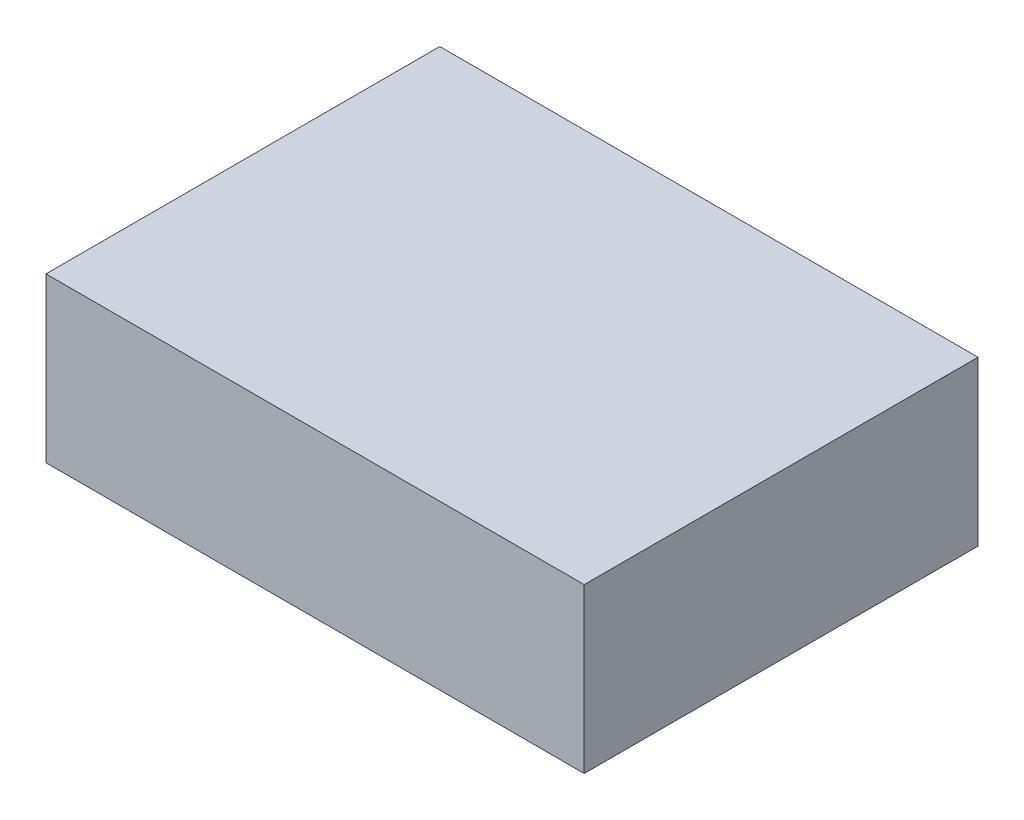
ISO-10303-21;
HEADER;
FILE_DESCRIPTION(('STEP AP214'),'2;1');
FILE_NAME('part.step','',(''),(''),'','','');
FILE_SCHEMA(('AUTOMOTIVE_DESIGN { 1 0 10303 214 1 1 1 1 }'));
ENDSEC;
DATA;
#1=APPLICATION_CONTEXT('core data for automotive mechanical design processes');
#2=APPLICATION_PROTOCOL_DEFINITION('international standard','automotive_design',2000,#1);
#3=PRODUCT_CONTEXT('',#1,'mechanical');
#4=PRODUCT('Part','Part','',(#3));
#5=PRODUCT_RELATED_PRODUCT_CATEGORY('part','',(#4));
#6=PRODUCT_DEFINITION_FORMATION('','',#4);
#7=PRODUCT_DEFINITION_CONTEXT('part definition',#1,'design');
#8=PRODUCT_DEFINITION('design','',#6,#7);
#9=PRODUCT_DEFINITION_SHAPE('','',#8);
#10=(LENGTH_UNIT() NAMED_UNIT(*) SI_UNIT(.MILLI.,.METRE.));
#11=(NAMED_UNIT(*) PLANE_ANGLE_UNIT() SI_UNIT($,.RADIAN.));
#12=(NAMED_UNIT(*) SI_UNIT($,.STERADIAN.) SOLID_ANGLE_UNIT());
#13=UNCERTAINTY_MEASURE_WITH_UNIT(LENGTH_MEASURE(1.E-05),#10,'distance_accuracy_value','');
#14=(GEOMETRIC_REPRESENTATION_CONTEXT(3) GLOBAL_UNCERTAINTY_ASSIGNED_CONTEXT((#13)) GLOBAL_UNIT_ASSIGNED_CONTEXT((#10,
#11,#12)) REPRESENTATION_CONTEXT('',''));
#15=CARTESIAN_POINT('',(0.,0.,0.));
#16=DIRECTION('',(0.,0.,1.));
#17=DIRECTION('',(1.,0.,0.));
#18=AXIS2_PLACEMENT_3D('',#15,#16,#17);
#19=CARTESIAN_POINT('',(26.65,16.2,-19.5));
#20=DIRECTION('',(-1.,0.,0.));
#21=DIRECTION('',(0.,0.,1.));
#22=AXIS2_PLACEMENT_3D('',#19,#20,#21);
#23=PLANE('',#22);
#24=DIRECTION('',(0.,0.,-1.));
#25=VECTOR('',#24,1.);
#26=CARTESIAN_POINT('',(26.65,0.,-19.5));
#27=LINE('',#26,#25);
#28=CARTESIAN_POINT('',(26.65,0.,19.5));
#29=VERTEX_POINT('',#28);
#30=CARTESIAN_POINT('',(26.65,0.,-19.5));
#31=VERTEX_POINT('',#30);
#32=EDGE_CURVE('E106',#29,#31,#27,.T.);
#33=ORIENTED_EDGE('',*,*,#32,.T.);
#34=DIRECTION('',(0.,-1.,0.));
#35=VECTOR('',#34,1.);
#36=CARTESIAN_POINT('',(26.65,16.2,-19.5));
#37=LINE('',#36,#35);
#38=CARTESIAN_POINT('',(26.65,16.2,-19.5));
#39=VERTEX_POINT('',#38);
#40=EDGE_CURVE('E11',#39,#31,#37,.T.);
#41=ORIENTED_EDGE('',*,*,#40,.F.);
#42=DIRECTION('',(0.,0.,-1.));
#43=VECTOR('',#42,1.);
#44=CARTESIAN_POINT('',(26.65,16.2,-19.5));
#45=LINE('',#44,#43);
#46=CARTESIAN_POINT('',(26.65,16.2,19.5));
#47=VERTEX_POINT('',#46);
#48=EDGE_CURVE('E92',#47,#39,#45,.T.);
#49=ORIENTED_EDGE('',*,*,#48,.F.);
#50=DIRECTION('',(0.,-1.,0.));
#51=VECTOR('',#50,1.);
#52=CARTESIAN_POINT('',(26.65,16.2,19.5));
#53=LINE('',#52,#51);
#54=EDGE_CURVE('E105',#47,#29,#53,.T.);
#55=ORIENTED_EDGE('',*,*,#54,.T.);
#56=EDGE_LOOP('',(#33,#41,#49,#55));
#57=FACE_BOUND('',#56,.T.);
#58=ADVANCED_FACE('F43',(#57),#23,.F.);
#59=CARTESIAN_POINT('',(-26.65,16.2,-19.5));
#60=DIRECTION('',(0.,0.,1.));
#61=DIRECTION('',(1.,0.,0.));
#62=AXIS2_PLACEMENT_3D('',#59,#60,#61);
#63=PLANE('',#62);
#64=DIRECTION('',(-1.,0.,0.));
#65=VECTOR('',#64,1.);
#66=CARTESIAN_POINT('',(-26.65,0.,-19.5));
#67=LINE('',#66,#65);
#68=CARTESIAN_POINT('',(-26.65,0.,-19.5));
#69=VERTEX_POINT('',#68);
#70=EDGE_CURVE('E97',#31,#69,#67,.T.);
#71=ORIENTED_EDGE('',*,*,#70,.T.);
#72=DIRECTION('',(0.,-1.,0.));
#73=VECTOR('',#72,1.);
#74=CARTESIAN_POINT('',(-26.65,16.2,-19.5));
#75=LINE('',#74,#73);
#76=CARTESIAN_POINT('',(-26.65,16.2,-19.5));
#77=VERTEX_POINT('',#76);
#78=EDGE_CURVE('E51',#77,#69,#75,.T.);
#79=ORIENTED_EDGE('',*,*,#78,.F.);
#80=DIRECTION('',(-1.,0.,0.));
#81=VECTOR('',#80,1.);
#82=CARTESIAN_POINT('',(-26.65,16.2,-19.5));
#83=LINE('',#82,#81);
#84=EDGE_CURVE('E87',#39,#77,#83,.T.);
#85=ORIENTED_EDGE('',*,*,#84,.F.);
#86=ORIENTED_EDGE('',*,*,#40,.T.);
#87=EDGE_LOOP('',(#71,#79,#85,#86));
#88=FACE_BOUND('',#87,.T.);
#89=ADVANCED_FACE('F100',(#88),#63,.F.);
#90=CARTESIAN_POINT('',(-26.65,16.2,-19.5));
#91=DIRECTION('',(1.,0.,0.));
#92=DIRECTION('',(0.,0.,-1.));
#93=AXIS2_PLACEMENT_3D('',#90,#91,#92);
#94=PLANE('',#93);
#95=DIRECTION('',(0.,0.,1.));
#96=VECTOR('',#95,1.);
#97=CARTESIAN_POINT('',(-26.65,0.,-19.5));
#98=LINE('',#97,#96);
#99=CARTESIAN_POINT('',(-26.65,0.,19.5));
#100=VERTEX_POINT('',#99);
#101=EDGE_CURVE('E78',#69,#100,#98,.T.);
#102=ORIENTED_EDGE('',*,*,#101,.T.);
#103=DIRECTION('',(0.,-1.,0.));
#104=VECTOR('',#103,1.);
#105=CARTESIAN_POINT('',(-26.65,16.2,19.5));
#106=LINE('',#105,#104);
#107=CARTESIAN_POINT('',(-26.65,16.2,19.5));
#108=VERTEX_POINT('',#107);
#109=EDGE_CURVE('E98',#108,#100,#106,.T.);
#110=ORIENTED_EDGE('',*,*,#109,.F.);
#111=DIRECTION('',(0.,0.,1.));
#112=VECTOR('',#111,1.);
#113=CARTESIAN_POINT('',(-26.65,16.2,-19.5));
#114=LINE('',#113,#112);
#115=EDGE_CURVE('E95',#77,#108,#114,.T.);
#116=ORIENTED_EDGE('',*,*,#115,.F.);
#117=ORIENTED_EDGE('',*,*,#78,.T.);
#118=EDGE_LOOP('',(#102,#110,#116,#117));
#119=FACE_BOUND('',#118,.T.);
#120=ADVANCED_FACE('F99',(#119),#94,.F.);
#121=CARTESIAN_POINT('',(-26.65,16.2,19.5));
#122=DIRECTION('',(0.,0.,-1.));
#123=DIRECTION('',(-1.,0.,0.));
#124=AXIS2_PLACEMENT_3D('',#121,#122,#123);
#125=PLANE('',#124);
#126=DIRECTION('',(1.,0.,0.));
#127=VECTOR('',#126,1.);
#128=CARTESIAN_POINT('',(-26.65,0.,19.5));
#129=LINE('',#128,#127);
#130=EDGE_CURVE('E85',#100,#29,#129,.T.);
#131=ORIENTED_EDGE('',*,*,#130,.T.);
#132=ORIENTED_EDGE('',*,*,#54,.F.);
#133=DIRECTION('',(1.,0.,0.));
#134=VECTOR('',#133,1.);
#135=CARTESIAN_POINT('',(-26.65,16.2,19.5));
#136=LINE('',#135,#134);
#137=EDGE_CURVE('E56',#108,#47,#136,.T.);
#138=ORIENTED_EDGE('',*,*,#137,.F.);
#139=ORIENTED_EDGE('',*,*,#109,.T.);
#140=EDGE_LOOP('',(#131,#132,#138,#139));
#141=FACE_BOUND('',#140,.T.);
#142=ADVANCED_FACE('F111',(#141),#125,.F.);
#143=CARTESIAN_POINT('',(0.,16.2,0.));
#144=DIRECTION('',(0.,1.,0.));
#145=DIRECTION('',(0.,0.,1.));
#146=AXIS2_PLACEMENT_3D('',#143,#144,#145);
#147=PLANE('',#146);
#148=ORIENTED_EDGE('',*,*,#48,.T.);
#149=ORIENTED_EDGE('',*,*,#84,.T.);
#150=ORIENTED_EDGE('',*,*,#115,.T.);
#151=ORIENTED_EDGE('',*,*,#137,.T.);
#152=EDGE_LOOP('',(#148,#149,#150,#151));
#153=FACE_BOUND('',#152,.T.);
#154=ADVANCED_FACE('F89',(#153),#147,.T.);
#155=CARTESIAN_POINT('',(0.,0.,0.));
#156=DIRECTION('',(0.,1.,0.));
#157=DIRECTION('',(0.,0.,1.));
#158=AXIS2_PLACEMENT_3D('',#155,#156,#157);
#159=PLANE('',#158);
#160=ORIENTED_EDGE('',*,*,#32,.F.);
#161=ORIENTED_EDGE('',*,*,#130,.F.);
#162=ORIENTED_EDGE('',*,*,#101,.F.);
#163=ORIENTED_EDGE('',*,*,#70,.F.);
#164=EDGE_LOOP('',(#160,#161,#162,#163));
#165=FACE_BOUND('',#164,.T.);
#166=ADVANCED_FACE('F116',(#165),#159,.F.);
#167=CLOSED_SHELL('',(#58,#89,#120,#142,#154,#166));
#168=MANIFOLD_SOLID_BREP('B2',#167);
#169=ADVANCED_BREP_SHAPE_REPRESENTATION('',(#18,#168),#14);
#170=SHAPE_DEFINITION_REPRESENTATION(#9,#169);
ENDSEC;
END-ISO-10303-21;
